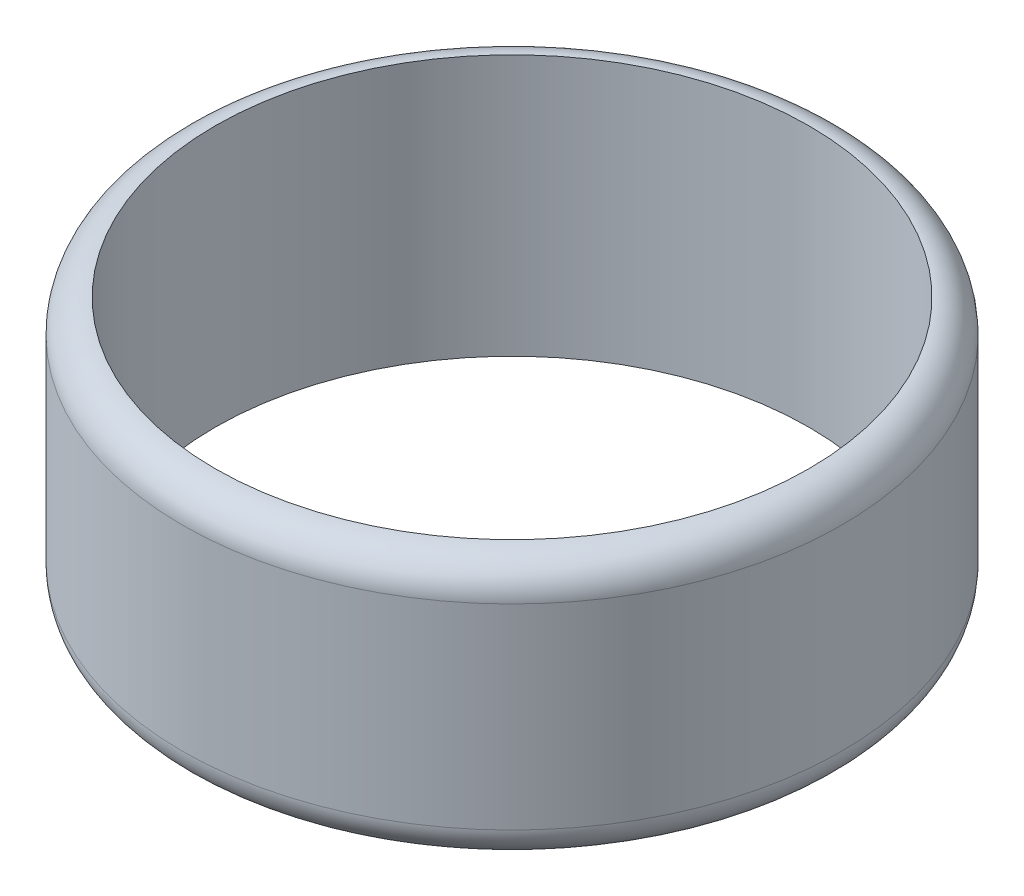
ISO-10303-21;
HEADER;
FILE_DESCRIPTION(('STEP AP214'),'2;1');
FILE_NAME('part.step','',(''),(''),'','','');
FILE_SCHEMA(('AUTOMOTIVE_DESIGN { 1 0 10303 214 1 1 1 1 }'));
ENDSEC;
DATA;
#1=APPLICATION_CONTEXT('core data for automotive mechanical design processes');
#2=APPLICATION_PROTOCOL_DEFINITION('international standard','automotive_design',2000,#1);
#3=PRODUCT_CONTEXT('',#1,'mechanical');
#4=PRODUCT('Part','Part','',(#3));
#5=PRODUCT_RELATED_PRODUCT_CATEGORY('part','',(#4));
#6=PRODUCT_DEFINITION_FORMATION('','',#4);
#7=PRODUCT_DEFINITION_CONTEXT('part definition',#1,'design');
#8=PRODUCT_DEFINITION('design','',#6,#7);
#9=PRODUCT_DEFINITION_SHAPE('','',#8);
#10=(LENGTH_UNIT() NAMED_UNIT(*) SI_UNIT(.MILLI.,.METRE.));
#11=(NAMED_UNIT(*) PLANE_ANGLE_UNIT() SI_UNIT($,.RADIAN.));
#12=(NAMED_UNIT(*) SI_UNIT($,.STERADIAN.) SOLID_ANGLE_UNIT());
#13=UNCERTAINTY_MEASURE_WITH_UNIT(LENGTH_MEASURE(1.E-05),#10,'distance_accuracy_value','');
#14=(GEOMETRIC_REPRESENTATION_CONTEXT(3) GLOBAL_UNCERTAINTY_ASSIGNED_CONTEXT((#13)) GLOBAL_UNIT_ASSIGNED_CONTEXT((#10,
#11,#12)) REPRESENTATION_CONTEXT('',''));
#15=CARTESIAN_POINT('',(0.,0.,0.));
#16=DIRECTION('',(0.,0.,1.));
#17=DIRECTION('',(1.,0.,0.));
#18=AXIS2_PLACEMENT_3D('',#15,#16,#17);
#19=CARTESIAN_POINT('',(0.,5.,0.));
#20=DIRECTION('',(0.,1.,0.));
#21=DIRECTION('',(0.,0.,1.));
#22=AXIS2_PLACEMENT_3D('',#19,#20,#21);
#23=TOROIDAL_SURFACE('',#22,45.5,5.);
#24=CARTESIAN_POINT('',(0.,0.,0.));
#25=DIRECTION('',(0.,1.,0.));
#26=DIRECTION('',(0.,0.,1.));
#27=AXIS2_PLACEMENT_3D('',#24,#25,#26);
#28=CIRCLE('',#27,45.5);
#29=CARTESIAN_POINT('',(0.,0.,45.5));
#30=VERTEX_POINT('',#29);
#31=EDGE_CURVE('E44',#30,#30,#28,.T.);
#32=ORIENTED_EDGE('',*,*,#31,.T.);
#33=EDGE_LOOP('',(#32));
#34=FACE_BOUND('',#33,.T.);
#35=CARTESIAN_POINT('',(0.,5.,0.));
#36=DIRECTION('',(0.,1.,0.));
#37=DIRECTION('',(0.,0.,1.));
#38=AXIS2_PLACEMENT_3D('',#35,#36,#37);
#39=CIRCLE('',#38,50.5);
#40=CARTESIAN_POINT('',(0.,5.,50.5));
#41=VERTEX_POINT('',#40);
#42=EDGE_CURVE('E10',#41,#41,#39,.T.);
#43=ORIENTED_EDGE('',*,*,#42,.F.);
#44=EDGE_LOOP('',(#43));
#45=FACE_BOUND('',#44,.T.);
#46=ADVANCED_FACE('F34',(#34,#45),#23,.T.);
#47=CARTESIAN_POINT('',(0.,35.,0.));
#48=DIRECTION('',(0.,1.,0.));
#49=DIRECTION('',(0.,0.,1.));
#50=AXIS2_PLACEMENT_3D('',#47,#48,#49);
#51=TOROIDAL_SURFACE('',#50,45.5,5.);
#52=CARTESIAN_POINT('',(0.,40.,0.));
#53=DIRECTION('',(0.,1.,0.));
#54=DIRECTION('',(0.,0.,1.));
#55=AXIS2_PLACEMENT_3D('',#52,#53,#54);
#56=CIRCLE('',#55,45.5);
#57=CARTESIAN_POINT('',(0.,40.,45.5));
#58=VERTEX_POINT('',#57);
#59=EDGE_CURVE('E48',#58,#58,#56,.T.);
#60=ORIENTED_EDGE('',*,*,#59,.F.);
#61=EDGE_LOOP('',(#60));
#62=FACE_BOUND('',#61,.T.);
#63=CARTESIAN_POINT('',(0.,35.,0.));
#64=DIRECTION('',(0.,1.,0.));
#65=DIRECTION('',(0.,0.,1.));
#66=AXIS2_PLACEMENT_3D('',#63,#64,#65);
#67=CIRCLE('',#66,50.5);
#68=CARTESIAN_POINT('',(0.,35.,50.5));
#69=VERTEX_POINT('',#68);
#70=EDGE_CURVE('E40',#69,#69,#67,.F.);
#71=ORIENTED_EDGE('',*,*,#70,.F.);
#72=EDGE_LOOP('',(#71));
#73=FACE_BOUND('',#72,.T.);
#74=ADVANCED_FACE('F56',(#62,#73),#51,.T.);
#75=CARTESIAN_POINT('',(0.,40.,0.));
#76=DIRECTION('',(0.,-1.,0.));
#77=DIRECTION('',(0.,0.,-1.));
#78=AXIS2_PLACEMENT_3D('',#75,#76,#77);
#79=CYLINDRICAL_SURFACE('',#78,50.5);
#80=ORIENTED_EDGE('',*,*,#42,.T.);
#81=EDGE_LOOP('',(#80));
#82=FACE_BOUND('',#81,.T.);
#83=ORIENTED_EDGE('',*,*,#70,.T.);
#84=EDGE_LOOP('',(#83));
#85=FACE_BOUND('',#84,.T.);
#86=ADVANCED_FACE('F59',(#82,#85),#79,.T.);
#87=CARTESIAN_POINT('',(0.,0.,0.));
#88=DIRECTION('',(0.,1.,0.));
#89=DIRECTION('',(0.,0.,1.));
#90=AXIS2_PLACEMENT_3D('',#87,#88,#89);
#91=CYLINDRICAL_SURFACE('',#90,45.5);
#92=ORIENTED_EDGE('',*,*,#31,.F.);
#93=EDGE_LOOP('',(#92));
#94=FACE_BOUND('',#93,.T.);
#95=ORIENTED_EDGE('',*,*,#59,.T.);
#96=EDGE_LOOP('',(#95));
#97=FACE_BOUND('',#96,.T.);
#98=ADVANCED_FACE('F54',(#94,#97),#91,.F.);
#99=CLOSED_SHELL('',(#46,#74,#86,#98));
#100=MANIFOLD_SOLID_BREP('B2',#99);
#101=ADVANCED_BREP_SHAPE_REPRESENTATION('',(#18,#100),#14);
#102=SHAPE_DEFINITION_REPRESENTATION(#9,#101);
ENDSEC;
END-ISO-10303-21;
